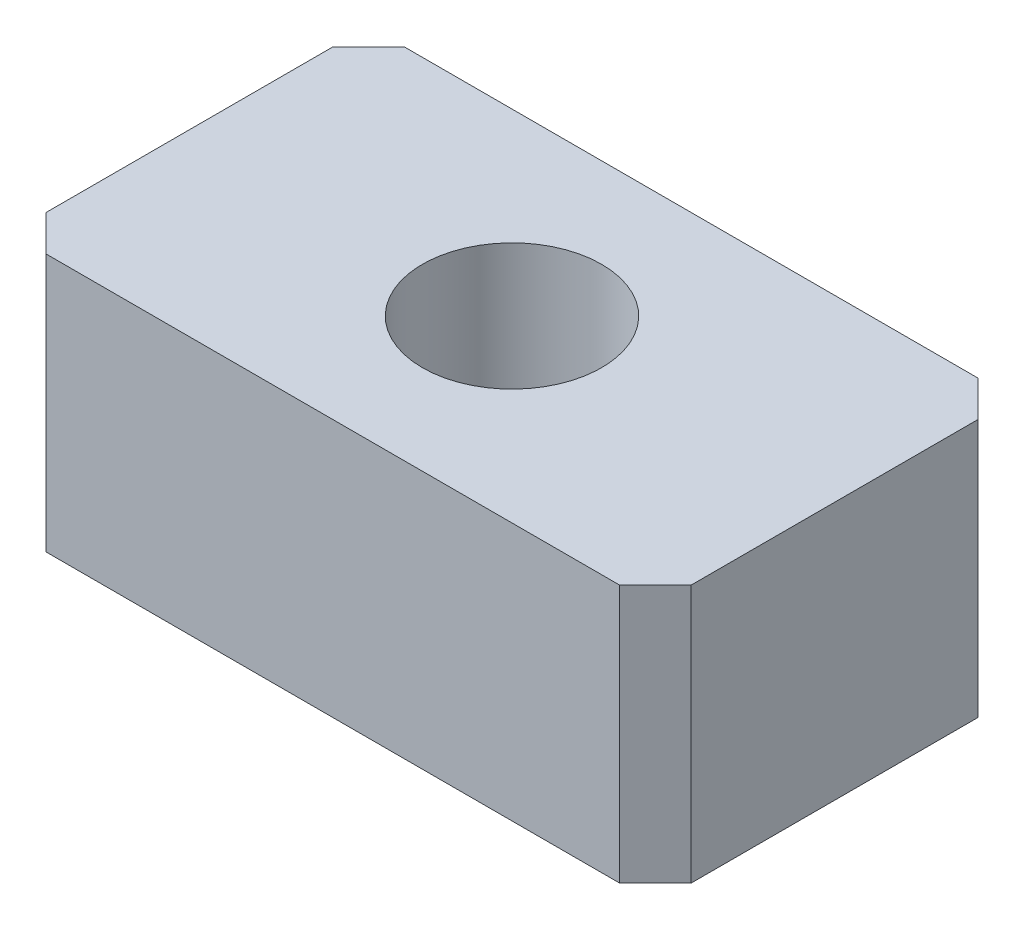
ISO-10303-21;
HEADER;
FILE_DESCRIPTION(('STEP AP214'),'2;1');
FILE_NAME('part.step','',(''),(''),'','','');
FILE_SCHEMA(('AUTOMOTIVE_DESIGN { 1 0 10303 214 1 1 1 1 }'));
ENDSEC;
DATA;
#1=APPLICATION_CONTEXT('core data for automotive mechanical design processes');
#2=APPLICATION_PROTOCOL_DEFINITION('international standard','automotive_design',2000,#1);
#3=PRODUCT_CONTEXT('',#1,'mechanical');
#4=PRODUCT('Part','Part','',(#3));
#5=PRODUCT_RELATED_PRODUCT_CATEGORY('part','',(#4));
#6=PRODUCT_DEFINITION_FORMATION('','',#4);
#7=PRODUCT_DEFINITION_CONTEXT('part definition',#1,'design');
#8=PRODUCT_DEFINITION('design','',#6,#7);
#9=PRODUCT_DEFINITION_SHAPE('','',#8);
#10=(LENGTH_UNIT() NAMED_UNIT(*) SI_UNIT(.MILLI.,.METRE.));
#11=(NAMED_UNIT(*) PLANE_ANGLE_UNIT() SI_UNIT($,.RADIAN.));
#12=(NAMED_UNIT(*) SI_UNIT($,.STERADIAN.) SOLID_ANGLE_UNIT());
#13=UNCERTAINTY_MEASURE_WITH_UNIT(LENGTH_MEASURE(1.E-05),#10,'distance_accuracy_value','');
#14=(GEOMETRIC_REPRESENTATION_CONTEXT(3) GLOBAL_UNCERTAINTY_ASSIGNED_CONTEXT((#13)) GLOBAL_UNIT_ASSIGNED_CONTEXT((#10,
#11,#12)) REPRESENTATION_CONTEXT('',''));
#15=CARTESIAN_POINT('',(0.,0.,0.));
#16=DIRECTION('',(0.,0.,1.));
#17=DIRECTION('',(1.,0.,0.));
#18=AXIS2_PLACEMENT_3D('',#15,#16,#17);
#19=CARTESIAN_POINT('',(0.,7.2,0.));
#20=DIRECTION('',(-1.,0.,0.));
#21=DIRECTION('',(0.,0.,1.));
#22=AXIS2_PLACEMENT_3D('',#19,#20,#21);
#23=PLANE('',#22);
#24=DIRECTION('',(0.,0.,-1.));
#25=VECTOR('',#24,1.);
#26=CARTESIAN_POINT('',(0.,0.,0.));
#27=LINE('',#26,#25);
#28=CARTESIAN_POINT('',(0.,0.,-1.));
#29=VERTEX_POINT('',#28);
#30=CARTESIAN_POINT('',(0.,0.,-9.));
#31=VERTEX_POINT('',#30);
#32=EDGE_CURVE('E142',#29,#31,#27,.T.);
#33=ORIENTED_EDGE('',*,*,#32,.T.);
#34=DIRECTION('',(0.,1.,0.));
#35=VECTOR('',#34,1.);
#36=CARTESIAN_POINT('',(0.,7.2,-9.));
#37=LINE('',#36,#35);
#38=CARTESIAN_POINT('',(0.,7.2,-9.));
#39=VERTEX_POINT('',#38);
#40=EDGE_CURVE('E176',#31,#39,#37,.T.);
#41=ORIENTED_EDGE('',*,*,#40,.T.);
#42=DIRECTION('',(0.,0.,-1.));
#43=VECTOR('',#42,1.);
#44=CARTESIAN_POINT('',(0.,7.2,0.));
#45=LINE('',#44,#43);
#46=CARTESIAN_POINT('',(0.,7.2,-1.));
#47=VERTEX_POINT('',#46);
#48=EDGE_CURVE('E140',#47,#39,#45,.T.);
#49=ORIENTED_EDGE('',*,*,#48,.F.);
#50=DIRECTION('',(0.,-1.,0.));
#51=VECTOR('',#50,1.);
#52=CARTESIAN_POINT('',(0.,7.2,-1.));
#53=LINE('',#52,#51);
#54=EDGE_CURVE('E172',#47,#29,#53,.T.);
#55=ORIENTED_EDGE('',*,*,#54,.T.);
#56=EDGE_LOOP('',(#33,#41,#49,#55));
#57=FACE_BOUND('',#56,.T.);
#58=ADVANCED_FACE('F40',(#57),#23,.F.);
#59=CARTESIAN_POINT('',(0.,7.2,-10.));
#60=DIRECTION('',(0.,0.,1.));
#61=DIRECTION('',(1.,0.,0.));
#62=AXIS2_PLACEMENT_3D('',#59,#60,#61);
#63=PLANE('',#62);
#64=DIRECTION('',(-1.,0.,0.));
#65=VECTOR('',#64,1.);
#66=CARTESIAN_POINT('',(0.,0.,-10.));
#67=LINE('',#66,#65);
#68=CARTESIAN_POINT('',(-0.999999999999997,0.,-10.));
#69=VERTEX_POINT('',#68);
#70=CARTESIAN_POINT('',(-17.,0.,-10.));
#71=VERTEX_POINT('',#70);
#72=EDGE_CURVE('E136',#69,#71,#67,.T.);
#73=ORIENTED_EDGE('',*,*,#72,.T.);
#74=DIRECTION('',(0.,1.,0.));
#75=VECTOR('',#74,1.);
#76=CARTESIAN_POINT('',(-17.,7.2,-10.));
#77=LINE('',#76,#75);
#78=CARTESIAN_POINT('',(-17.,7.2,-10.));
#79=VERTEX_POINT('',#78);
#80=EDGE_CURVE('E112',#71,#79,#77,.T.);
#81=ORIENTED_EDGE('',*,*,#80,.T.);
#82=DIRECTION('',(-1.,0.,0.));
#83=VECTOR('',#82,1.);
#84=CARTESIAN_POINT('',(0.,7.2,-10.));
#85=LINE('',#84,#83);
#86=CARTESIAN_POINT('',(-0.999999999999997,7.2,-10.));
#87=VERTEX_POINT('',#86);
#88=EDGE_CURVE('E195',#87,#79,#85,.T.);
#89=ORIENTED_EDGE('',*,*,#88,.F.);
#90=DIRECTION('',(0.,-1.,0.));
#91=VECTOR('',#90,1.);
#92=CARTESIAN_POINT('',(-0.999999999999997,7.2,-10.));
#93=LINE('',#92,#91);
#94=EDGE_CURVE('E118',#87,#69,#93,.T.);
#95=ORIENTED_EDGE('',*,*,#94,.T.);
#96=EDGE_LOOP('',(#73,#81,#89,#95));
#97=FACE_BOUND('',#96,.T.);
#98=ADVANCED_FACE('F225',(#97),#63,.F.);
#99=CARTESIAN_POINT('',(-18.,7.2,0.));
#100=DIRECTION('',(1.,0.,0.));
#101=DIRECTION('',(0.,0.,-1.));
#102=AXIS2_PLACEMENT_3D('',#99,#100,#101);
#103=PLANE('',#102);
#104=DIRECTION('',(0.,0.,1.));
#105=VECTOR('',#104,1.);
#106=CARTESIAN_POINT('',(-18.,7.2,0.));
#107=LINE('',#106,#105);
#108=CARTESIAN_POINT('',(-18.,7.2,-9.));
#109=VERTEX_POINT('',#108);
#110=CARTESIAN_POINT('',(-18.,7.2,-1.));
#111=VERTEX_POINT('',#110);
#112=EDGE_CURVE('E127',#109,#111,#107,.T.);
#113=ORIENTED_EDGE('',*,*,#112,.F.);
#114=DIRECTION('',(0.,-1.,0.));
#115=VECTOR('',#114,1.);
#116=CARTESIAN_POINT('',(-18.,7.2,-9.));
#117=LINE('',#116,#115);
#118=CARTESIAN_POINT('',(-18.,0.,-9.));
#119=VERTEX_POINT('',#118);
#120=EDGE_CURVE('E111',#109,#119,#117,.T.);
#121=ORIENTED_EDGE('',*,*,#120,.T.);
#122=DIRECTION('',(0.,0.,1.));
#123=VECTOR('',#122,1.);
#124=CARTESIAN_POINT('',(-18.,0.,0.));
#125=LINE('',#124,#123);
#126=CARTESIAN_POINT('',(-18.,0.,-1.));
#127=VERTEX_POINT('',#126);
#128=EDGE_CURVE('E125',#119,#127,#125,.T.);
#129=ORIENTED_EDGE('',*,*,#128,.T.);
#130=DIRECTION('',(0.,1.,0.));
#131=VECTOR('',#130,1.);
#132=CARTESIAN_POINT('',(-18.,7.2,-1.));
#133=LINE('',#132,#131);
#134=EDGE_CURVE('E130',#127,#111,#133,.T.);
#135=ORIENTED_EDGE('',*,*,#134,.T.);
#136=EDGE_LOOP('',(#113,#121,#129,#135));
#137=FACE_BOUND('',#136,.T.);
#138=ADVANCED_FACE('F124',(#137),#103,.F.);
#139=CARTESIAN_POINT('',(0.,7.2,0.));
#140=DIRECTION('',(0.,0.,-1.));
#141=DIRECTION('',(-1.,0.,0.));
#142=AXIS2_PLACEMENT_3D('',#139,#140,#141);
#143=PLANE('',#142);
#144=DIRECTION('',(1.,0.,0.));
#145=VECTOR('',#144,1.);
#146=CARTESIAN_POINT('',(0.,0.,0.));
#147=LINE('',#146,#145);
#148=CARTESIAN_POINT('',(-17.,0.,0.));
#149=VERTEX_POINT('',#148);
#150=CARTESIAN_POINT('',(-1.,0.,0.));
#151=VERTEX_POINT('',#150);
#152=EDGE_CURVE('E135',#149,#151,#147,.T.);
#153=ORIENTED_EDGE('',*,*,#152,.T.);
#154=DIRECTION('',(0.,1.,0.));
#155=VECTOR('',#154,1.);
#156=CARTESIAN_POINT('',(-1.,7.2,0.));
#157=LINE('',#156,#155);
#158=CARTESIAN_POINT('',(-1.,7.2,0.));
#159=VERTEX_POINT('',#158);
#160=EDGE_CURVE('E11',#151,#159,#157,.T.);
#161=ORIENTED_EDGE('',*,*,#160,.T.);
#162=DIRECTION('',(1.,0.,0.));
#163=VECTOR('',#162,1.);
#164=CARTESIAN_POINT('',(0.,7.2,0.));
#165=LINE('',#164,#163);
#166=CARTESIAN_POINT('',(-17.,7.2,0.));
#167=VERTEX_POINT('',#166);
#168=EDGE_CURVE('E147',#167,#159,#165,.T.);
#169=ORIENTED_EDGE('',*,*,#168,.F.);
#170=DIRECTION('',(0.,-1.,0.));
#171=VECTOR('',#170,1.);
#172=CARTESIAN_POINT('',(-17.,7.2,0.));
#173=LINE('',#172,#171);
#174=EDGE_CURVE('E50',#167,#149,#173,.T.);
#175=ORIENTED_EDGE('',*,*,#174,.T.);
#176=EDGE_LOOP('',(#153,#161,#169,#175));
#177=FACE_BOUND('',#176,.T.);
#178=ADVANCED_FACE('F181',(#177),#143,.F.);
#179=CARTESIAN_POINT('',(0.,7.2,0.));
#180=DIRECTION('',(0.,1.,0.));
#181=DIRECTION('',(0.,0.,1.));
#182=AXIS2_PLACEMENT_3D('',#179,#180,#181);
#183=PLANE('',#182);
#184=CARTESIAN_POINT('',(-9.,7.2,-5.));
#185=DIRECTION('',(0.,1.,0.));
#186=DIRECTION('',(0.,0.,1.));
#187=AXIS2_PLACEMENT_3D('',#184,#185,#186);
#188=CIRCLE('',#187,2.5);
#189=CARTESIAN_POINT('',(-9.,7.2,-2.5));
#190=VERTEX_POINT('',#189);
#191=EDGE_CURVE('E201',#190,#190,#188,.T.);
#192=ORIENTED_EDGE('',*,*,#191,.F.);
#193=EDGE_LOOP('',(#192));
#194=FACE_BOUND('',#193,.T.);
#195=ORIENTED_EDGE('',*,*,#88,.T.);
#196=DIRECTION('',(0.707106781186549,0.,-0.707106781186546));
#197=VECTOR('',#196,1.);
#198=CARTESIAN_POINT('',(-13.5,7.2,-13.5));
#199=LINE('',#198,#197);
#200=EDGE_CURVE('E169',#79,#109,#199,.F.);
#201=ORIENTED_EDGE('',*,*,#200,.T.);
#202=ORIENTED_EDGE('',*,*,#112,.T.);
#203=DIRECTION('',(-0.707106781186546,0.,-0.707106781186549));
#204=VECTOR('',#203,1.);
#205=CARTESIAN_POINT('',(-8.50000000000003,7.2,8.5));
#206=LINE('',#205,#204);
#207=EDGE_CURVE('E62',#111,#167,#206,.F.);
#208=ORIENTED_EDGE('',*,*,#207,.T.);
#209=ORIENTED_EDGE('',*,*,#168,.T.);
#210=DIRECTION('',(-0.707106781186548,0.,0.707106781186547));
#211=VECTOR('',#210,1.);
#212=CARTESIAN_POINT('',(-0.5,7.2,-0.500000000000001));
#213=LINE('',#212,#211);
#214=EDGE_CURVE('E163',#159,#47,#213,.F.);
#215=ORIENTED_EDGE('',*,*,#214,.T.);
#216=ORIENTED_EDGE('',*,*,#48,.T.);
#217=DIRECTION('',(0.707106781186547,0.,0.707106781186548));
#218=VECTOR('',#217,1.);
#219=CARTESIAN_POINT('',(4.5,7.2,-4.49999999999999));
#220=LINE('',#219,#218);
#221=EDGE_CURVE('E166',#39,#87,#220,.F.);
#222=ORIENTED_EDGE('',*,*,#221,.T.);
#223=EDGE_LOOP('',(#195,#201,#202,#208,#209,#215,#216,#222));
#224=FACE_BOUND('',#223,.T.);
#225=ADVANCED_FACE('F219',(#194,#224),#183,.T.);
#226=CARTESIAN_POINT('',(0.,0.,0.));
#227=DIRECTION('',(0.,1.,0.));
#228=DIRECTION('',(0.,0.,1.));
#229=AXIS2_PLACEMENT_3D('',#226,#227,#228);
#230=PLANE('',#229);
#231=CARTESIAN_POINT('',(-9.,0.,-5.));
#232=DIRECTION('',(0.,1.,0.));
#233=DIRECTION('',(0.,0.,1.));
#234=AXIS2_PLACEMENT_3D('',#231,#232,#233);
#235=CIRCLE('',#234,2.5);
#236=CARTESIAN_POINT('',(-9.,0.,-2.5));
#237=VERTEX_POINT('',#236);
#238=EDGE_CURVE('E208',#237,#237,#235,.T.);
#239=ORIENTED_EDGE('',*,*,#238,.T.);
#240=EDGE_LOOP('',(#239));
#241=FACE_BOUND('',#240,.T.);
#242=ORIENTED_EDGE('',*,*,#128,.F.);
#243=DIRECTION('',(-0.707106781186549,0.,0.707106781186546));
#244=VECTOR('',#243,1.);
#245=CARTESIAN_POINT('',(-18.,0.,-9.));
#246=LINE('',#245,#244);
#247=EDGE_CURVE('E107',#119,#71,#246,.F.);
#248=ORIENTED_EDGE('',*,*,#247,.T.);
#249=ORIENTED_EDGE('',*,*,#72,.F.);
#250=DIRECTION('',(-0.707106781186547,0.,-0.707106781186548));
#251=VECTOR('',#250,1.);
#252=CARTESIAN_POINT('',(-0.999999999999997,0.,-10.));
#253=LINE('',#252,#251);
#254=EDGE_CURVE('E119',#69,#31,#253,.F.);
#255=ORIENTED_EDGE('',*,*,#254,.T.);
#256=ORIENTED_EDGE('',*,*,#32,.F.);
#257=DIRECTION('',(0.707106781186548,0.,-0.707106781186547));
#258=VECTOR('',#257,1.);
#259=CARTESIAN_POINT('',(0.,0.,-1.));
#260=LINE('',#259,#258);
#261=EDGE_CURVE('E151',#29,#151,#260,.F.);
#262=ORIENTED_EDGE('',*,*,#261,.T.);
#263=ORIENTED_EDGE('',*,*,#152,.F.);
#264=DIRECTION('',(0.707106781186546,0.,0.707106781186549));
#265=VECTOR('',#264,1.);
#266=CARTESIAN_POINT('',(-17.,0.,0.));
#267=LINE('',#266,#265);
#268=EDGE_CURVE('E129',#149,#127,#267,.F.);
#269=ORIENTED_EDGE('',*,*,#268,.T.);
#270=EDGE_LOOP('',(#242,#248,#249,#255,#256,#262,#263,#269));
#271=FACE_BOUND('',#270,.T.);
#272=ADVANCED_FACE('F132',(#241,#271),#230,.F.);
#273=CARTESIAN_POINT('',(-9.,0.,-5.));
#274=DIRECTION('',(0.,1.,0.));
#275=DIRECTION('',(0.,0.,1.));
#276=AXIS2_PLACEMENT_3D('',#273,#274,#275);
#277=CYLINDRICAL_SURFACE('',#276,2.5);
#278=ORIENTED_EDGE('',*,*,#238,.F.);
#279=EDGE_LOOP('',(#278));
#280=FACE_BOUND('',#279,.T.);
#281=ORIENTED_EDGE('',*,*,#191,.T.);
#282=EDGE_LOOP('',(#281));
#283=FACE_BOUND('',#282,.T.);
#284=ADVANCED_FACE('F217',(#280,#283),#277,.F.);
#285=CARTESIAN_POINT('',(-18.,7.2,-9.));
#286=DIRECTION('',(0.707106781186546,0.,0.707106781186549));
#287=DIRECTION('',(0.,-1.,0.));
#288=AXIS2_PLACEMENT_3D('',#285,#286,#287);
#289=PLANE('',#288);
#290=ORIENTED_EDGE('',*,*,#200,.F.);
#291=ORIENTED_EDGE('',*,*,#80,.F.);
#292=ORIENTED_EDGE('',*,*,#247,.F.);
#293=ORIENTED_EDGE('',*,*,#120,.F.);
#294=EDGE_LOOP('',(#290,#291,#292,#293));
#295=FACE_BOUND('',#294,.T.);
#296=ADVANCED_FACE('F110',(#295),#289,.F.);
#297=CARTESIAN_POINT('',(-0.999999999999997,7.2,-10.));
#298=DIRECTION('',(-0.707106781186548,0.,0.707106781186547));
#299=DIRECTION('',(0.,-1.,0.));
#300=AXIS2_PLACEMENT_3D('',#297,#298,#299);
#301=PLANE('',#300);
#302=ORIENTED_EDGE('',*,*,#221,.F.);
#303=ORIENTED_EDGE('',*,*,#40,.F.);
#304=ORIENTED_EDGE('',*,*,#254,.F.);
#305=ORIENTED_EDGE('',*,*,#94,.F.);
#306=EDGE_LOOP('',(#302,#303,#304,#305));
#307=FACE_BOUND('',#306,.T.);
#308=ADVANCED_FACE('F227',(#307),#301,.F.);
#309=CARTESIAN_POINT('',(0.,7.2,-1.));
#310=DIRECTION('',(-0.707106781186547,0.,-0.707106781186548));
#311=DIRECTION('',(0.,-1.,0.));
#312=AXIS2_PLACEMENT_3D('',#309,#310,#311);
#313=PLANE('',#312);
#314=ORIENTED_EDGE('',*,*,#214,.F.);
#315=ORIENTED_EDGE('',*,*,#160,.F.);
#316=ORIENTED_EDGE('',*,*,#261,.F.);
#317=ORIENTED_EDGE('',*,*,#54,.F.);
#318=EDGE_LOOP('',(#314,#315,#316,#317));
#319=FACE_BOUND('',#318,.T.);
#320=ADVANCED_FACE('F188',(#319),#313,.F.);
#321=CARTESIAN_POINT('',(-17.,7.2,0.));
#322=DIRECTION('',(0.707106781186549,0.,-0.707106781186546));
#323=DIRECTION('',(0.,-1.,0.));
#324=AXIS2_PLACEMENT_3D('',#321,#322,#323);
#325=PLANE('',#324);
#326=ORIENTED_EDGE('',*,*,#207,.F.);
#327=ORIENTED_EDGE('',*,*,#134,.F.);
#328=ORIENTED_EDGE('',*,*,#268,.F.);
#329=ORIENTED_EDGE('',*,*,#174,.F.);
#330=EDGE_LOOP('',(#326,#327,#328,#329));
#331=FACE_BOUND('',#330,.T.);
#332=ADVANCED_FACE('F43',(#331),#325,.F.);
#333=CLOSED_SHELL('',(#58,#98,#138,#178,#225,#272,#284,#296,#308,#320,#332));
#334=MANIFOLD_SOLID_BREP('B2',#333);
#335=ADVANCED_BREP_SHAPE_REPRESENTATION('',(#18,#334),#14);
#336=SHAPE_DEFINITION_REPRESENTATION(#9,#335);
ENDSEC;
END-ISO-10303-21;
